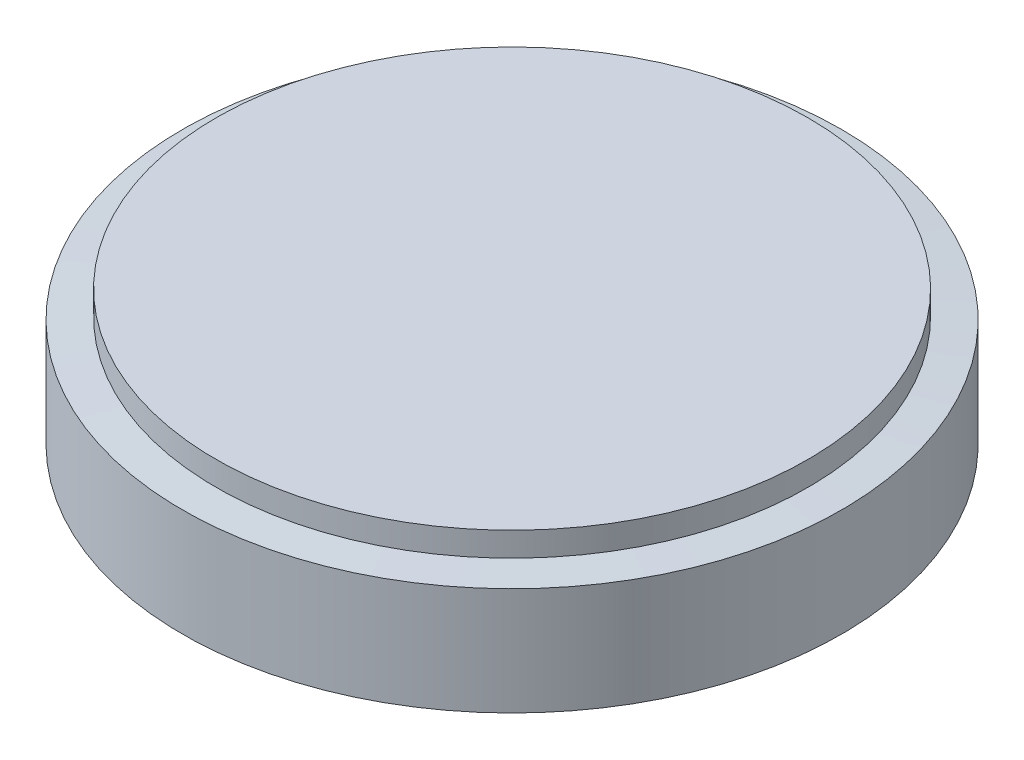
ISO-10303-21;
HEADER;
FILE_DESCRIPTION(('STEP AP214'),'2;1');
FILE_NAME('part.step','',(''),(''),'','','');
FILE_SCHEMA(('AUTOMOTIVE_DESIGN { 1 0 10303 214 1 1 1 1 }'));
ENDSEC;
DATA;
#1=APPLICATION_CONTEXT('core data for automotive mechanical design processes');
#2=APPLICATION_PROTOCOL_DEFINITION('international standard','automotive_design',2000,#1);
#3=PRODUCT_CONTEXT('',#1,'mechanical');
#4=PRODUCT('Part','Part','',(#3));
#5=PRODUCT_RELATED_PRODUCT_CATEGORY('part','',(#4));
#6=PRODUCT_DEFINITION_FORMATION('','',#4);
#7=PRODUCT_DEFINITION_CONTEXT('part definition',#1,'design');
#8=PRODUCT_DEFINITION('design','',#6,#7);
#9=PRODUCT_DEFINITION_SHAPE('','',#8);
#10=(LENGTH_UNIT() NAMED_UNIT(*) SI_UNIT(.MILLI.,.METRE.));
#11=(NAMED_UNIT(*) PLANE_ANGLE_UNIT() SI_UNIT($,.RADIAN.));
#12=(NAMED_UNIT(*) SI_UNIT($,.STERADIAN.) SOLID_ANGLE_UNIT());
#13=UNCERTAINTY_MEASURE_WITH_UNIT(LENGTH_MEASURE(1.E-05),#10,'distance_accuracy_value','');
#14=(GEOMETRIC_REPRESENTATION_CONTEXT(3) GLOBAL_UNCERTAINTY_ASSIGNED_CONTEXT((#13)) GLOBAL_UNIT_ASSIGNED_CONTEXT((#10,
#11,#12)) REPRESENTATION_CONTEXT('',''));
#15=CARTESIAN_POINT('',(0.,0.,0.));
#16=DIRECTION('',(0.,0.,1.));
#17=DIRECTION('',(1.,0.,0.));
#18=AXIS2_PLACEMENT_3D('',#15,#16,#17);
#19=CARTESIAN_POINT('',(0.,0.,0.));
#20=DIRECTION('',(0.,-1.,0.));
#21=DIRECTION('',(0.,0.,-1.));
#22=AXIS2_PLACEMENT_3D('',#19,#20,#21);
#23=CYLINDRICAL_SURFACE('',#22,11.);
#24=CARTESIAN_POINT('',(0.,5.,0.));
#25=DIRECTION('',(0.,-1.,0.));
#26=DIRECTION('',(0.,0.,-1.));
#27=AXIS2_PLACEMENT_3D('',#24,#25,#26);
#28=CIRCLE('',#27,11.);
#29=CARTESIAN_POINT('',(0.,5.,-11.));
#30=VERTEX_POINT('',#29);
#31=EDGE_CURVE('E47',#30,#30,#28,.T.);
#32=ORIENTED_EDGE('',*,*,#31,.T.);
#33=EDGE_LOOP('',(#32));
#34=FACE_BOUND('',#33,.T.);
#35=CARTESIAN_POINT('',(0.,4.1,0.));
#36=DIRECTION('',(0.,-1.,0.));
#37=DIRECTION('',(0.,0.,-1.));
#38=AXIS2_PLACEMENT_3D('',#35,#36,#37);
#39=CIRCLE('',#38,11.);
#40=CARTESIAN_POINT('',(0.,4.1,-11.));
#41=VERTEX_POINT('',#40);
#42=EDGE_CURVE('E11',#41,#41,#39,.T.);
#43=ORIENTED_EDGE('',*,*,#42,.F.);
#44=EDGE_LOOP('',(#43));
#45=FACE_BOUND('',#44,.T.);
#46=ADVANCED_FACE('F40',(#34,#45),#23,.T.);
#47=CARTESIAN_POINT('',(-11.,5.,0.));
#48=DIRECTION('',(0.,-1.,0.));
#49=DIRECTION('',(0.,0.,-1.));
#50=AXIS2_PLACEMENT_3D('',#47,#48,#49);
#51=PLANE('',#50);
#52=ORIENTED_EDGE('',*,*,#31,.F.);
#53=EDGE_LOOP('',(#52));
#54=FACE_BOUND('',#53,.T.);
#55=ADVANCED_FACE('F72',(#54),#51,.F.);
#56=CARTESIAN_POINT('',(0.,0.,0.));
#57=DIRECTION('',(0.,-1.,0.));
#58=DIRECTION('',(0.,0.,-1.));
#59=AXIS2_PLACEMENT_3D('',#56,#57,#58);
#60=CYLINDRICAL_SURFACE('',#59,12.25);
#61=CARTESIAN_POINT('',(0.,4.,0.));
#62=DIRECTION('',(0.,-1.,0.));
#63=DIRECTION('',(0.,0.,-1.));
#64=AXIS2_PLACEMENT_3D('',#61,#62,#63);
#65=CIRCLE('',#64,12.25);
#66=CARTESIAN_POINT('',(0.,4.,-12.25));
#67=VERTEX_POINT('',#66);
#68=EDGE_CURVE('E55',#67,#67,#65,.T.);
#69=ORIENTED_EDGE('',*,*,#68,.T.);
#70=EDGE_LOOP('',(#69));
#71=FACE_BOUND('',#70,.T.);
#72=CARTESIAN_POINT('',(0.,0.,0.));
#73=DIRECTION('',(0.,-1.,0.));
#74=DIRECTION('',(0.,0.,-1.));
#75=AXIS2_PLACEMENT_3D('',#72,#73,#74);
#76=CIRCLE('',#75,12.25);
#77=CARTESIAN_POINT('',(0.,0.,-12.25));
#78=VERTEX_POINT('',#77);
#79=EDGE_CURVE('E51',#78,#78,#76,.T.);
#80=ORIENTED_EDGE('',*,*,#79,.F.);
#81=EDGE_LOOP('',(#80));
#82=FACE_BOUND('',#81,.T.);
#83=ADVANCED_FACE('F61',(#71,#82),#60,.T.);
#84=CARTESIAN_POINT('',(0.,4.1,0.));
#85=DIRECTION('',(0.,-1.,0.));
#86=DIRECTION('',(0.,0.,-1.));
#87=AXIS2_PLACEMENT_3D('',#84,#85,#86);
#88=CONICAL_SURFACE('',#87,11.,1.49096634108266);
#89=ORIENTED_EDGE('',*,*,#68,.F.);
#90=EDGE_LOOP('',(#89));
#91=FACE_BOUND('',#90,.T.);
#92=ORIENTED_EDGE('',*,*,#42,.T.);
#93=EDGE_LOOP('',(#92));
#94=FACE_BOUND('',#93,.T.);
#95=ADVANCED_FACE('F64',(#91,#94),#88,.T.);
#96=CARTESIAN_POINT('',(0.,0.,0.));
#97=DIRECTION('',(0.,1.,0.));
#98=DIRECTION('',(0.,0.,1.));
#99=AXIS2_PLACEMENT_3D('',#96,#97,#98);
#100=PLANE('',#99);
#101=ORIENTED_EDGE('',*,*,#79,.T.);
#102=EDGE_LOOP('',(#101));
#103=FACE_BOUND('',#102,.T.);
#104=ADVANCED_FACE('F42',(#103),#100,.F.);
#105=CLOSED_SHELL('',(#46,#55,#83,#95,#104));
#106=MANIFOLD_SOLID_BREP('B2',#105);
#107=ADVANCED_BREP_SHAPE_REPRESENTATION('',(#18,#106),#14);
#108=SHAPE_DEFINITION_REPRESENTATION(#9,#107);
ENDSEC;
END-ISO-10303-21;
